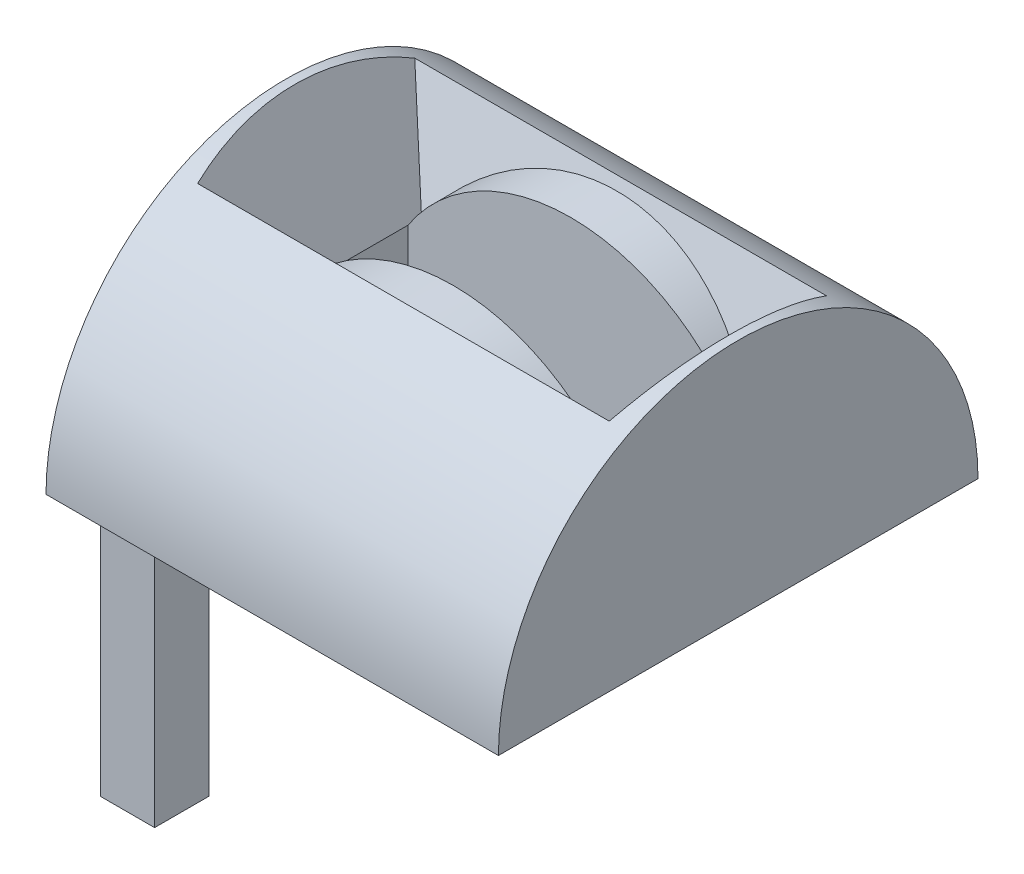
ISO-10303-21;
HEADER;
FILE_DESCRIPTION(('STEP AP214'),'2;1');
FILE_NAME('part.step','',(''),(''),'','','');
FILE_SCHEMA(('AUTOMOTIVE_DESIGN { 1 0 10303 214 1 1 1 1 }'));
ENDSEC;
DATA;
#1=APPLICATION_CONTEXT('core data for automotive mechanical design processes');
#2=APPLICATION_PROTOCOL_DEFINITION('international standard','automotive_design',2000,#1);
#3=PRODUCT_CONTEXT('',#1,'mechanical');
#4=PRODUCT('Part','Part','',(#3));
#5=PRODUCT_RELATED_PRODUCT_CATEGORY('part','',(#4));
#6=PRODUCT_DEFINITION_FORMATION('','',#4);
#7=PRODUCT_DEFINITION_CONTEXT('part definition',#1,'design');
#8=PRODUCT_DEFINITION('design','',#6,#7);
#9=PRODUCT_DEFINITION_SHAPE('','',#8);
#10=(LENGTH_UNIT() NAMED_UNIT(*) SI_UNIT(.MILLI.,.METRE.));
#11=(NAMED_UNIT(*) PLANE_ANGLE_UNIT() SI_UNIT($,.RADIAN.));
#12=(NAMED_UNIT(*) SI_UNIT($,.STERADIAN.) SOLID_ANGLE_UNIT());
#13=UNCERTAINTY_MEASURE_WITH_UNIT(LENGTH_MEASURE(1.E-05),#10,'distance_accuracy_value','');
#14=(GEOMETRIC_REPRESENTATION_CONTEXT(3) GLOBAL_UNCERTAINTY_ASSIGNED_CONTEXT((#13)) GLOBAL_UNIT_ASSIGNED_CONTEXT((#10,
#11,#12)) REPRESENTATION_CONTEXT('',''));
#15=CARTESIAN_POINT('',(0.,0.,0.));
#16=DIRECTION('',(0.,0.,1.));
#17=DIRECTION('',(1.,0.,0.));
#18=AXIS2_PLACEMENT_3D('',#15,#16,#17);
#19=CARTESIAN_POINT('',(12.5,-8.05,-13.25));
#20=DIRECTION('',(0.,1.,0.));
#21=DIRECTION('',(0.,0.,1.));
#22=AXIS2_PLACEMENT_3D('',#19,#20,#21);
#23=PLANE('',#22);
#24=DIRECTION('',(0.,0.,1.));
#25=VECTOR('',#24,1.);
#26=CARTESIAN_POINT('',(9.,-8.05,-13.25));
#27=LINE('',#26,#25);
#28=CARTESIAN_POINT('',(9.,-8.05,-3.25));
#29=VERTEX_POINT('',#28);
#30=CARTESIAN_POINT('',(9.,-8.05,3.25));
#31=VERTEX_POINT('',#30);
#32=EDGE_CURVE('E249',#29,#31,#27,.T.);
#33=ORIENTED_EDGE('',*,*,#32,.F.);
#34=DIRECTION('',(-1.,0.,0.));
#35=VECTOR('',#34,1.);
#36=CARTESIAN_POINT('',(0.,-8.05,-3.25));
#37=LINE('',#36,#35);
#38=CARTESIAN_POINT('',(-9.,-8.05,-3.25));
#39=VERTEX_POINT('',#38);
#40=EDGE_CURVE('E236',#29,#39,#37,.T.);
#41=ORIENTED_EDGE('',*,*,#40,.T.);
#42=DIRECTION('',(0.,0.,1.));
#43=VECTOR('',#42,1.);
#44=CARTESIAN_POINT('',(-9.,-8.05,-13.25));
#45=LINE('',#44,#43);
#46=CARTESIAN_POINT('',(-9.,-8.05,3.25));
#47=VERTEX_POINT('',#46);
#48=EDGE_CURVE('E222',#39,#47,#45,.T.);
#49=ORIENTED_EDGE('',*,*,#48,.T.);
#50=DIRECTION('',(-1.,0.,0.));
#51=VECTOR('',#50,1.);
#52=CARTESIAN_POINT('',(0.,-8.05,3.25));
#53=LINE('',#52,#51);
#54=EDGE_CURVE('E195',#31,#47,#53,.T.);
#55=ORIENTED_EDGE('',*,*,#54,.F.);
#56=EDGE_LOOP('',(#33,#41,#49,#55));
#57=FACE_BOUND('',#56,.T.);
#58=DIRECTION('',(0.,0.,-1.));
#59=VECTOR('',#58,1.);
#60=CARTESIAN_POINT('',(-12.5,-8.05,-13.25));
#61=LINE('',#60,#59);
#62=CARTESIAN_POINT('',(-12.5,-8.05,13.25));
#63=VERTEX_POINT('',#62);
#64=CARTESIAN_POINT('',(-12.5,-8.05,-13.25));
#65=VERTEX_POINT('',#64);
#66=EDGE_CURVE('E224',#63,#65,#61,.T.);
#67=ORIENTED_EDGE('',*,*,#66,.T.);
#68=DIRECTION('',(-1.,0.,0.));
#69=VECTOR('',#68,1.);
#70=CARTESIAN_POINT('',(12.5,-8.05,-13.25));
#71=LINE('',#70,#69);
#72=CARTESIAN_POINT('',(12.5,-8.05,-13.25));
#73=VERTEX_POINT('',#72);
#74=EDGE_CURVE('E11',#73,#65,#71,.T.);
#75=ORIENTED_EDGE('',*,*,#74,.F.);
#76=DIRECTION('',(0.,0.,-1.));
#77=VECTOR('',#76,1.);
#78=CARTESIAN_POINT('',(12.5,-8.05,-13.25));
#79=LINE('',#78,#77);
#80=CARTESIAN_POINT('',(12.5,-8.05,13.25));
#81=VERTEX_POINT('',#80);
#82=EDGE_CURVE('E251',#81,#73,#79,.T.);
#83=ORIENTED_EDGE('',*,*,#82,.F.);
#84=DIRECTION('',(-1.,0.,0.));
#85=VECTOR('',#84,1.);
#86=CARTESIAN_POINT('',(12.5,-8.05,13.25));
#87=LINE('',#86,#85);
#88=EDGE_CURVE('E207',#81,#63,#87,.T.);
#89=ORIENTED_EDGE('',*,*,#88,.T.);
#90=EDGE_LOOP('',(#67,#75,#83,#89));
#91=FACE_BOUND('',#90,.T.);
#92=DIRECTION('',(0.,0.,-1.));
#93=VECTOR('',#92,1.);
#94=CARTESIAN_POINT('',(-8.5,-8.05,8.25));
#95=LINE('',#94,#93);
#96=CARTESIAN_POINT('',(-8.5,-8.05,11.25));
#97=VERTEX_POINT('',#96);
#98=CARTESIAN_POINT('',(-8.5,-8.05,8.25));
#99=VERTEX_POINT('',#98);
#100=EDGE_CURVE('E150',#97,#99,#95,.T.);
#101=ORIENTED_EDGE('',*,*,#100,.T.);
#102=DIRECTION('',(-1.,0.,0.));
#103=VECTOR('',#102,1.);
#104=CARTESIAN_POINT('',(-8.5,-8.05,8.25));
#105=LINE('',#104,#103);
#106=CARTESIAN_POINT('',(-11.5,-8.05,8.25));
#107=VERTEX_POINT('',#106);
#108=EDGE_CURVE('E163',#99,#107,#105,.T.);
#109=ORIENTED_EDGE('',*,*,#108,.T.);
#110=DIRECTION('',(0.,0.,-1.));
#111=VECTOR('',#110,1.);
#112=CARTESIAN_POINT('',(-11.5,-8.05,8.25));
#113=LINE('',#112,#111);
#114=CARTESIAN_POINT('',(-11.5,-8.05,11.25));
#115=VERTEX_POINT('',#114);
#116=EDGE_CURVE('E164',#115,#107,#113,.T.);
#117=ORIENTED_EDGE('',*,*,#116,.F.);
#118=DIRECTION('',(-1.,0.,0.));
#119=VECTOR('',#118,1.);
#120=CARTESIAN_POINT('',(-8.5,-8.05,11.25));
#121=LINE('',#120,#119);
#122=EDGE_CURVE('E176',#97,#115,#121,.T.);
#123=ORIENTED_EDGE('',*,*,#122,.F.);
#124=EDGE_LOOP('',(#101,#109,#117,#123));
#125=FACE_BOUND('',#124,.T.);
#126=ADVANCED_FACE('F41',(#57,#91,#125),#23,.F.);
#127=CARTESIAN_POINT('',(9.,7.2,4.));
#128=DIRECTION('',(-1.,0.,0.));
#129=DIRECTION('',(0.,0.,1.));
#130=AXIS2_PLACEMENT_3D('',#127,#128,#129);
#131=PLANE('',#130);
#132=DIRECTION('',(0.,0.,1.));
#133=VECTOR('',#132,1.);
#134=CARTESIAN_POINT('',(9.,-1.67101199184758,-11.4973865974827));
#135=LINE('',#134,#133);
#136=CARTESIAN_POINT('',(9.,-1.67101199184758,-3.25));
#137=VERTEX_POINT('',#136);
#138=CARTESIAN_POINT('',(9.,-1.67101199184758,3.25));
#139=VERTEX_POINT('',#138);
#140=EDGE_CURVE('E242',#137,#139,#135,.T.);
#141=ORIENTED_EDGE('',*,*,#140,.F.);
#142=DIRECTION('',(0.,1.,0.));
#143=VECTOR('',#142,1.);
#144=CARTESIAN_POINT('',(9.,-7.55,-3.25));
#145=LINE('',#144,#143);
#146=EDGE_CURVE('E231',#29,#137,#145,.T.);
#147=ORIENTED_EDGE('',*,*,#146,.F.);
#148=ORIENTED_EDGE('',*,*,#32,.T.);
#149=DIRECTION('',(0.,1.,0.));
#150=VECTOR('',#149,1.);
#151=CARTESIAN_POINT('',(9.,-7.55,3.25));
#152=LINE('',#151,#150);
#153=EDGE_CURVE('E189',#31,#139,#152,.T.);
#154=ORIENTED_EDGE('',*,*,#153,.T.);
#155=EDGE_LOOP('',(#141,#147,#148,#154));
#156=FACE_BOUND('',#155,.T.);
#157=ADVANCED_FACE('F282',(#156),#131,.T.);
#158=CARTESIAN_POINT('',(12.5,-8.05,0.));
#159=DIRECTION('',(-1.,0.,0.));
#160=DIRECTION('',(0.,0.,1.));
#161=AXIS2_PLACEMENT_3D('',#158,#159,#160);
#162=CYLINDRICAL_SURFACE('',#161,13.25);
#163=CARTESIAN_POINT('',(-6.21482598965579,-8.05,0.));
#164=DIRECTION('',(0.9164542741006,0.400139430052503,0.));
#165=DIRECTION('',(0.400139430052503,-0.9164542741006,0.));
#166=AXIS2_PLACEMENT_3D('',#163,#164,#165);
#167=ELLIPSE('',#166,14.4578953630866,13.25);
#168=CARTESIAN_POINT('',(-11.3728685158779,3.76365735071066,-6.));
#169=VERTEX_POINT('',#168);
#170=CARTESIAN_POINT('',(-11.3728685158779,3.76365735071066,6.));
#171=VERTEX_POINT('',#170);
#172=EDGE_CURVE('E220',#169,#171,#167,.T.);
#173=ORIENTED_EDGE('',*,*,#172,.F.);
#174=DIRECTION('',(-1.,0.,0.));
#175=VECTOR('',#174,1.);
#176=CARTESIAN_POINT('',(17.2291620843581,3.76365735071066,-6.));
#177=LINE('',#176,#175);
#178=CARTESIAN_POINT('',(11.3728685158779,3.76365735071066,-6.));
#179=VERTEX_POINT('',#178);
#180=EDGE_CURVE('E238',#179,#169,#177,.T.);
#181=ORIENTED_EDGE('',*,*,#180,.F.);
#182=CARTESIAN_POINT('',(6.21482598965579,-8.05,0.));
#183=DIRECTION('',(0.9164542741006,-0.400139430052503,0.));
#184=DIRECTION('',(-0.400139430052503,-0.9164542741006,0.));
#185=AXIS2_PLACEMENT_3D('',#182,#183,#184);
#186=ELLIPSE('',#185,14.4578953630866,13.25);
#187=CARTESIAN_POINT('',(11.3728685158779,3.76365735071066,6.));
#188=VERTEX_POINT('',#187);
#189=EDGE_CURVE('E247',#179,#188,#186,.T.);
#190=ORIENTED_EDGE('',*,*,#189,.T.);
#191=DIRECTION('',(-1.,0.,0.));
#192=VECTOR('',#191,1.);
#193=CARTESIAN_POINT('',(17.2291620843581,3.76365735071066,6.));
#194=LINE('',#193,#192);
#195=EDGE_CURVE('E198',#188,#171,#194,.T.);
#196=ORIENTED_EDGE('',*,*,#195,.T.);
#197=EDGE_LOOP('',(#173,#181,#190,#196));
#198=FACE_BOUND('',#197,.T.);
#199=ORIENTED_EDGE('',*,*,#74,.T.);
#200=CARTESIAN_POINT('',(-12.5,-8.05,0.));
#201=DIRECTION('',(1.,0.,0.));
#202=DIRECTION('',(0.,0.,1.));
#203=AXIS2_PLACEMENT_3D('',#200,#201,#202);
#204=CIRCLE('',#203,13.25);
#205=EDGE_CURVE('E227',#65,#63,#204,.T.);
#206=ORIENTED_EDGE('',*,*,#205,.T.);
#207=ORIENTED_EDGE('',*,*,#88,.F.);
#208=CARTESIAN_POINT('',(12.5,-8.05,0.));
#209=DIRECTION('',(1.,0.,0.));
#210=DIRECTION('',(0.,0.,1.));
#211=AXIS2_PLACEMENT_3D('',#208,#209,#210);
#212=CIRCLE('',#211,13.25);
#213=EDGE_CURVE('E48',#73,#81,#212,.T.);
#214=ORIENTED_EDGE('',*,*,#213,.F.);
#215=EDGE_LOOP('',(#199,#206,#207,#214));
#216=FACE_BOUND('',#215,.T.);
#217=ADVANCED_FACE('F258',(#198,#216),#162,.T.);
#218=CARTESIAN_POINT('',(12.5,-8.05,0.));
#219=DIRECTION('',(-1.,0.,0.));
#220=DIRECTION('',(0.,0.,1.));
#221=AXIS2_PLACEMENT_3D('',#218,#219,#220);
#222=PLANE('',#221);
#223=ORIENTED_EDGE('',*,*,#82,.T.);
#224=ORIENTED_EDGE('',*,*,#213,.T.);
#225=EDGE_LOOP('',(#223,#224));
#226=FACE_BOUND('',#225,.T.);
#227=ADVANCED_FACE('F254',(#226),#222,.F.);
#228=CARTESIAN_POINT('',(9.,-1.67101199184758,-11.4973865974827));
#229=DIRECTION('',(0.9164542741006,-0.400139430052503,0.));
#230=DIRECTION('',(0.400139430052503,0.9164542741006,0.));
#231=AXIS2_PLACEMENT_3D('',#228,#229,#230);
#232=PLANE('',#231);
#233=ORIENTED_EDGE('',*,*,#189,.F.);
#234=DIRECTION('',(0.379156330055042,0.86839589686437,-0.319576350326989));
#235=VECTOR('',#234,1.);
#236=CARTESIAN_POINT('',(10.1830204128166,1.03850382250681,-4.99712260068391));
#237=LINE('',#236,#235);
#238=CARTESIAN_POINT('',(9.,-1.67101199184758,-4.));
#239=VERTEX_POINT('',#238);
#240=EDGE_CURVE('E239',#239,#179,#237,.T.);
#241=ORIENTED_EDGE('',*,*,#240,.F.);
#242=EDGE_CURVE('E244',#239,#137,#135,.T.);
#243=ORIENTED_EDGE('',*,*,#242,.T.);
#244=ORIENTED_EDGE('',*,*,#140,.T.);
#245=DIRECTION('',(0.,0.,-1.));
#246=VECTOR('',#245,1.);
#247=CARTESIAN_POINT('',(9.,-1.67101199184758,11.4973865974827));
#248=LINE('',#247,#246);
#249=CARTESIAN_POINT('',(9.,-1.67101199184758,4.));
#250=VERTEX_POINT('',#249);
#251=EDGE_CURVE('E202',#250,#139,#248,.T.);
#252=ORIENTED_EDGE('',*,*,#251,.F.);
#253=DIRECTION('',(0.379156330055042,0.86839589686437,0.319576350326989));
#254=VECTOR('',#253,1.);
#255=CARTESIAN_POINT('',(10.1830204128166,1.03850382250681,4.99712260068391));
#256=LINE('',#255,#254);
#257=EDGE_CURVE('E199',#250,#188,#256,.T.);
#258=ORIENTED_EDGE('',*,*,#257,.T.);
#259=EDGE_LOOP('',(#233,#241,#243,#244,#252,#258));
#260=FACE_BOUND('',#259,.T.);
#261=ADVANCED_FACE('F315',(#260),#232,.F.);
#262=CARTESIAN_POINT('',(17.2291620843581,-1.67101199184758,-4.));
#263=DIRECTION('',(0.,0.345363753244326,0.938468900893893));
#264=DIRECTION('',(0.,-0.938468900893893,0.345363753244326));
#265=AXIS2_PLACEMENT_3D('',#262,#263,#264);
#266=PLANE('',#265);
#267=ORIENTED_EDGE('',*,*,#180,.T.);
#268=DIRECTION('',(-0.379156330055042,0.86839589686437,-0.319576350326989));
#269=VECTOR('',#268,1.);
#270=CARTESIAN_POINT('',(-10.1830204128166,1.03850382250681,-4.99712260068391));
#271=LINE('',#270,#269);
#272=CARTESIAN_POINT('',(-9.,-1.67101199184758,-4.));
#273=VERTEX_POINT('',#272);
#274=EDGE_CURVE('E213',#273,#169,#271,.T.);
#275=ORIENTED_EDGE('',*,*,#274,.F.);
#276=CARTESIAN_POINT('',(0.,-7.55,-1.83648732329867));
#277=DIRECTION('',(0.,0.345363753244326,0.938468900893893));
#278=DIRECTION('',(0.,-0.938468900893893,0.345363753244326));
#279=AXIS2_PLACEMENT_3D('',#276,#277,#278);
#280=ELLIPSE('',#279,11.4548281671994,10.75);
#281=EDGE_CURVE('E229',#239,#273,#280,.T.);
#282=ORIENTED_EDGE('',*,*,#281,.F.);
#283=ORIENTED_EDGE('',*,*,#240,.T.);
#284=EDGE_LOOP('',(#267,#275,#282,#283));
#285=FACE_BOUND('',#284,.T.);
#286=ADVANCED_FACE('F320',(#285),#266,.T.);
#287=CARTESIAN_POINT('',(0.,-7.55,-13.252));
#288=DIRECTION('',(0.,0.,1.));
#289=DIRECTION('',(1.,0.,0.));
#290=AXIS2_PLACEMENT_3D('',#287,#288,#289);
#291=CYLINDRICAL_SURFACE('',#290,10.75);
#292=ORIENTED_EDGE('',*,*,#242,.F.);
#293=ORIENTED_EDGE('',*,*,#281,.T.);
#294=DIRECTION('',(0.,0.,1.));
#295=VECTOR('',#294,1.);
#296=CARTESIAN_POINT('',(-9.,-1.67101199184758,-11.4973865974827));
#297=LINE('',#296,#295);
#298=CARTESIAN_POINT('',(-9.,-1.67101199184758,-3.25));
#299=VERTEX_POINT('',#298);
#300=EDGE_CURVE('E217',#273,#299,#297,.T.);
#301=ORIENTED_EDGE('',*,*,#300,.T.);
#302=CARTESIAN_POINT('',(0.,-7.55,-3.25));
#303=DIRECTION('',(0.,0.,-1.));
#304=DIRECTION('',(-1.,0.,0.));
#305=AXIS2_PLACEMENT_3D('',#302,#303,#304);
#306=CIRCLE('',#305,10.75);
#307=EDGE_CURVE('E233',#299,#137,#306,.T.);
#308=ORIENTED_EDGE('',*,*,#307,.T.);
#309=EDGE_LOOP('',(#292,#293,#301,#308));
#310=FACE_BOUND('',#309,.T.);
#311=ADVANCED_FACE('F279',(#310),#291,.T.);
#312=CARTESIAN_POINT('',(0.,-7.55,-3.25));
#313=DIRECTION('',(0.,0.,-1.));
#314=DIRECTION('',(-1.,0.,0.));
#315=AXIS2_PLACEMENT_3D('',#312,#313,#314);
#316=PLANE('',#315);
#317=ORIENTED_EDGE('',*,*,#40,.F.);
#318=ORIENTED_EDGE('',*,*,#146,.T.);
#319=ORIENTED_EDGE('',*,*,#307,.F.);
#320=DIRECTION('',(0.,1.,0.));
#321=VECTOR('',#320,1.);
#322=CARTESIAN_POINT('',(-9.,-7.55,-3.25));
#323=LINE('',#322,#321);
#324=EDGE_CURVE('E210',#39,#299,#323,.T.);
#325=ORIENTED_EDGE('',*,*,#324,.F.);
#326=EDGE_LOOP('',(#317,#318,#319,#325));
#327=FACE_BOUND('',#326,.T.);
#328=ADVANCED_FACE('F276',(#327),#316,.F.);
#329=CARTESIAN_POINT('',(-9.,7.2,4.));
#330=DIRECTION('',(1.,0.,0.));
#331=DIRECTION('',(0.,0.,1.));
#332=AXIS2_PLACEMENT_3D('',#329,#330,#331);
#333=PLANE('',#332);
#334=CARTESIAN_POINT('',(-9.,-1.67101199184758,3.25));
#335=VERTEX_POINT('',#334);
#336=EDGE_CURVE('E216',#299,#335,#297,.T.);
#337=ORIENTED_EDGE('',*,*,#336,.T.);
#338=DIRECTION('',(0.,1.,0.));
#339=VECTOR('',#338,1.);
#340=CARTESIAN_POINT('',(-9.,-7.55,3.25));
#341=LINE('',#340,#339);
#342=EDGE_CURVE('E175',#47,#335,#341,.T.);
#343=ORIENTED_EDGE('',*,*,#342,.F.);
#344=ORIENTED_EDGE('',*,*,#48,.F.);
#345=ORIENTED_EDGE('',*,*,#324,.T.);
#346=EDGE_LOOP('',(#337,#343,#344,#345));
#347=FACE_BOUND('',#346,.T.);
#348=ADVANCED_FACE('F265',(#347),#333,.T.);
#349=CARTESIAN_POINT('',(-12.5,-8.05,0.));
#350=DIRECTION('',(1.,0.,0.));
#351=DIRECTION('',(0.,0.,1.));
#352=AXIS2_PLACEMENT_3D('',#349,#350,#351);
#353=PLANE('',#352);
#354=ORIENTED_EDGE('',*,*,#66,.F.);
#355=ORIENTED_EDGE('',*,*,#205,.F.);
#356=EDGE_LOOP('',(#354,#355));
#357=FACE_BOUND('',#356,.T.);
#358=ADVANCED_FACE('F262',(#357),#353,.F.);
#359=CARTESIAN_POINT('',(-9.,-1.67101199184758,-11.4973865974827));
#360=DIRECTION('',(-0.9164542741006,-0.400139430052503,0.));
#361=DIRECTION('',(-0.400139430052503,0.9164542741006,0.));
#362=AXIS2_PLACEMENT_3D('',#359,#360,#361);
#363=PLANE('',#362);
#364=ORIENTED_EDGE('',*,*,#172,.T.);
#365=DIRECTION('',(-0.379156330055042,0.86839589686437,0.319576350326989));
#366=VECTOR('',#365,1.);
#367=CARTESIAN_POINT('',(-10.1830204128166,1.03850382250681,4.99712260068391));
#368=LINE('',#367,#366);
#369=CARTESIAN_POINT('',(-9.,-1.67101199184758,4.));
#370=VERTEX_POINT('',#369);
#371=EDGE_CURVE('E181',#370,#171,#368,.T.);
#372=ORIENTED_EDGE('',*,*,#371,.F.);
#373=DIRECTION('',(0.,0.,-1.));
#374=VECTOR('',#373,1.);
#375=CARTESIAN_POINT('',(-9.,-1.67101199184758,11.4973865974827));
#376=LINE('',#375,#374);
#377=EDGE_CURVE('E184',#370,#335,#376,.T.);
#378=ORIENTED_EDGE('',*,*,#377,.T.);
#379=ORIENTED_EDGE('',*,*,#336,.F.);
#380=ORIENTED_EDGE('',*,*,#300,.F.);
#381=ORIENTED_EDGE('',*,*,#274,.T.);
#382=EDGE_LOOP('',(#364,#372,#378,#379,#380,#381));
#383=FACE_BOUND('',#382,.T.);
#384=ADVANCED_FACE('F264',(#383),#363,.F.);
#385=CARTESIAN_POINT('',(17.2291620843581,-1.67101199184758,4.));
#386=DIRECTION('',(0.,0.345363753244326,-0.938468900893893));
#387=DIRECTION('',(0.,-0.938468900893893,-0.345363753244326));
#388=AXIS2_PLACEMENT_3D('',#385,#386,#387);
#389=PLANE('',#388);
#390=CARTESIAN_POINT('',(0.,-7.55,1.83648732329867));
#391=DIRECTION('',(0.,-0.345363753244326,0.938468900893893));
#392=DIRECTION('',(0.,-0.938468900893893,-0.345363753244326));
#393=AXIS2_PLACEMENT_3D('',#390,#391,#392);
#394=ELLIPSE('',#393,11.4548281671994,10.75);
#395=EDGE_CURVE('E187',#250,#370,#394,.T.);
#396=ORIENTED_EDGE('',*,*,#395,.T.);
#397=ORIENTED_EDGE('',*,*,#371,.T.);
#398=ORIENTED_EDGE('',*,*,#195,.F.);
#399=ORIENTED_EDGE('',*,*,#257,.F.);
#400=EDGE_LOOP('',(#396,#397,#398,#399));
#401=FACE_BOUND('',#400,.T.);
#402=ADVANCED_FACE('F272',(#401),#389,.T.);
#403=CARTESIAN_POINT('',(0.,-7.55,13.252));
#404=DIRECTION('',(0.,0.,-1.));
#405=DIRECTION('',(1.,0.,0.));
#406=AXIS2_PLACEMENT_3D('',#403,#404,#405);
#407=CYLINDRICAL_SURFACE('',#406,10.75);
#408=ORIENTED_EDGE('',*,*,#251,.T.);
#409=CARTESIAN_POINT('',(0.,-7.55,3.25));
#410=DIRECTION('',(0.,0.,-1.));
#411=DIRECTION('',(-1.,0.,0.));
#412=AXIS2_PLACEMENT_3D('',#409,#410,#411);
#413=CIRCLE('',#412,10.75);
#414=EDGE_CURVE('E192',#335,#139,#413,.T.);
#415=ORIENTED_EDGE('',*,*,#414,.F.);
#416=ORIENTED_EDGE('',*,*,#377,.F.);
#417=ORIENTED_EDGE('',*,*,#395,.F.);
#418=EDGE_LOOP('',(#408,#415,#416,#417));
#419=FACE_BOUND('',#418,.T.);
#420=ADVANCED_FACE('F312',(#419),#407,.T.);
#421=CARTESIAN_POINT('',(0.,-7.55,3.25));
#422=DIRECTION('',(0.,0.,1.));
#423=DIRECTION('',(-1.,0.,0.));
#424=AXIS2_PLACEMENT_3D('',#421,#422,#423);
#425=PLANE('',#424);
#426=ORIENTED_EDGE('',*,*,#54,.T.);
#427=ORIENTED_EDGE('',*,*,#342,.T.);
#428=ORIENTED_EDGE('',*,*,#414,.T.);
#429=ORIENTED_EDGE('',*,*,#153,.F.);
#430=EDGE_LOOP('',(#426,#427,#428,#429));
#431=FACE_BOUND('',#430,.T.);
#432=ADVANCED_FACE('F310',(#431),#425,.F.);
#433=CARTESIAN_POINT('',(-8.5,-8.05,8.25));
#434=DIRECTION('',(0.,0.,-1.));
#435=DIRECTION('',(0.,1.,0.));
#436=AXIS2_PLACEMENT_3D('',#433,#434,#435);
#437=PLANE('',#436);
#438=DIRECTION('',(0.,-1.,0.));
#439=VECTOR('',#438,1.);
#440=CARTESIAN_POINT('',(-11.5,-8.05,8.25));
#441=LINE('',#440,#439);
#442=CARTESIAN_POINT('',(-11.5,-23.,8.25));
#443=VERTEX_POINT('',#442);
#444=EDGE_CURVE('E170',#107,#443,#441,.T.);
#445=ORIENTED_EDGE('',*,*,#444,.F.);
#446=ORIENTED_EDGE('',*,*,#108,.F.);
#447=DIRECTION('',(0.,-1.,0.));
#448=VECTOR('',#447,1.);
#449=CARTESIAN_POINT('',(-8.5,-8.05,8.25));
#450=LINE('',#449,#448);
#451=CARTESIAN_POINT('',(-8.5,-23.,8.25));
#452=VERTEX_POINT('',#451);
#453=EDGE_CURVE('E157',#99,#452,#450,.T.);
#454=ORIENTED_EDGE('',*,*,#453,.T.);
#455=DIRECTION('',(-1.,0.,0.));
#456=VECTOR('',#455,1.);
#457=CARTESIAN_POINT('',(-8.5,-23.,8.25));
#458=LINE('',#457,#456);
#459=EDGE_CURVE('E141',#452,#443,#458,.T.);
#460=ORIENTED_EDGE('',*,*,#459,.T.);
#461=EDGE_LOOP('',(#445,#446,#454,#460));
#462=FACE_BOUND('',#461,.T.);
#463=ADVANCED_FACE('F161',(#462),#437,.T.);
#464=CARTESIAN_POINT('',(-8.5,-8.05,11.25));
#465=DIRECTION('',(0.,0.,1.));
#466=DIRECTION('',(0.,-1.,0.));
#467=AXIS2_PLACEMENT_3D('',#464,#465,#466);
#468=PLANE('',#467);
#469=DIRECTION('',(0.,1.,0.));
#470=VECTOR('',#469,1.);
#471=CARTESIAN_POINT('',(-11.5,-8.05,11.25));
#472=LINE('',#471,#470);
#473=CARTESIAN_POINT('',(-11.5,-23.,11.25));
#474=VERTEX_POINT('',#473);
#475=EDGE_CURVE('E55',#474,#115,#472,.T.);
#476=ORIENTED_EDGE('',*,*,#475,.F.);
#477=DIRECTION('',(-1.,0.,0.));
#478=VECTOR('',#477,1.);
#479=CARTESIAN_POINT('',(-8.5,-23.,11.25));
#480=LINE('',#479,#478);
#481=CARTESIAN_POINT('',(-8.5,-23.,11.25));
#482=VERTEX_POINT('',#481);
#483=EDGE_CURVE('E149',#482,#474,#480,.T.);
#484=ORIENTED_EDGE('',*,*,#483,.F.);
#485=DIRECTION('',(0.,1.,0.));
#486=VECTOR('',#485,1.);
#487=CARTESIAN_POINT('',(-8.5,-8.05,11.25));
#488=LINE('',#487,#486);
#489=EDGE_CURVE('E159',#482,#97,#488,.T.);
#490=ORIENTED_EDGE('',*,*,#489,.T.);
#491=ORIENTED_EDGE('',*,*,#122,.T.);
#492=EDGE_LOOP('',(#476,#484,#490,#491));
#493=FACE_BOUND('',#492,.T.);
#494=ADVANCED_FACE('F337',(#493),#468,.T.);
#495=CARTESIAN_POINT('',(-8.5,-23.,8.25));
#496=DIRECTION('',(0.,-1.,0.));
#497=DIRECTION('',(0.,0.,-1.));
#498=AXIS2_PLACEMENT_3D('',#495,#496,#497);
#499=PLANE('',#498);
#500=DIRECTION('',(0.,0.,1.));
#501=VECTOR('',#500,1.);
#502=CARTESIAN_POINT('',(-11.5,-23.,8.25));
#503=LINE('',#502,#501);
#504=EDGE_CURVE('E145',#443,#474,#503,.T.);
#505=ORIENTED_EDGE('',*,*,#504,.F.);
#506=ORIENTED_EDGE('',*,*,#459,.F.);
#507=DIRECTION('',(0.,0.,1.));
#508=VECTOR('',#507,1.);
#509=CARTESIAN_POINT('',(-8.5,-23.,8.25));
#510=LINE('',#509,#508);
#511=EDGE_CURVE('E144',#452,#482,#510,.T.);
#512=ORIENTED_EDGE('',*,*,#511,.T.);
#513=ORIENTED_EDGE('',*,*,#483,.T.);
#514=EDGE_LOOP('',(#505,#506,#512,#513));
#515=FACE_BOUND('',#514,.T.);
#516=ADVANCED_FACE('F143',(#515),#499,.T.);
#517=CARTESIAN_POINT('',(-8.5,0.,0.));
#518=DIRECTION('',(-1.,0.,0.));
#519=DIRECTION('',(0.,0.,1.));
#520=AXIS2_PLACEMENT_3D('',#517,#518,#519);
#521=PLANE('',#520);
#522=ORIENTED_EDGE('',*,*,#453,.F.);
#523=ORIENTED_EDGE('',*,*,#100,.F.);
#524=ORIENTED_EDGE('',*,*,#489,.F.);
#525=ORIENTED_EDGE('',*,*,#511,.F.);
#526=EDGE_LOOP('',(#522,#523,#524,#525));
#527=FACE_BOUND('',#526,.T.);
#528=ADVANCED_FACE('F155',(#527),#521,.F.);
#529=CARTESIAN_POINT('',(-11.5,0.,0.));
#530=DIRECTION('',(-1.,0.,0.));
#531=DIRECTION('',(0.,0.,1.));
#532=AXIS2_PLACEMENT_3D('',#529,#530,#531);
#533=PLANE('',#532);
#534=ORIENTED_EDGE('',*,*,#444,.T.);
#535=ORIENTED_EDGE('',*,*,#504,.T.);
#536=ORIENTED_EDGE('',*,*,#475,.T.);
#537=ORIENTED_EDGE('',*,*,#116,.T.);
#538=EDGE_LOOP('',(#534,#535,#536,#537));
#539=FACE_BOUND('',#538,.T.);
#540=ADVANCED_FACE('F343',(#539),#533,.T.);
#541=CLOSED_SHELL('',(#126,#157,#217,#227,#261,#286,#311,#328,#348,#358,#384,#402,#420,#432,
#463,#494,#516,#528,#540));
#542=MANIFOLD_SOLID_BREP('B2',#541);
#543=ADVANCED_BREP_SHAPE_REPRESENTATION('',(#18,#542),#14);
#544=SHAPE_DEFINITION_REPRESENTATION(#9,#543);
ENDSEC;
END-ISO-10303-21;
